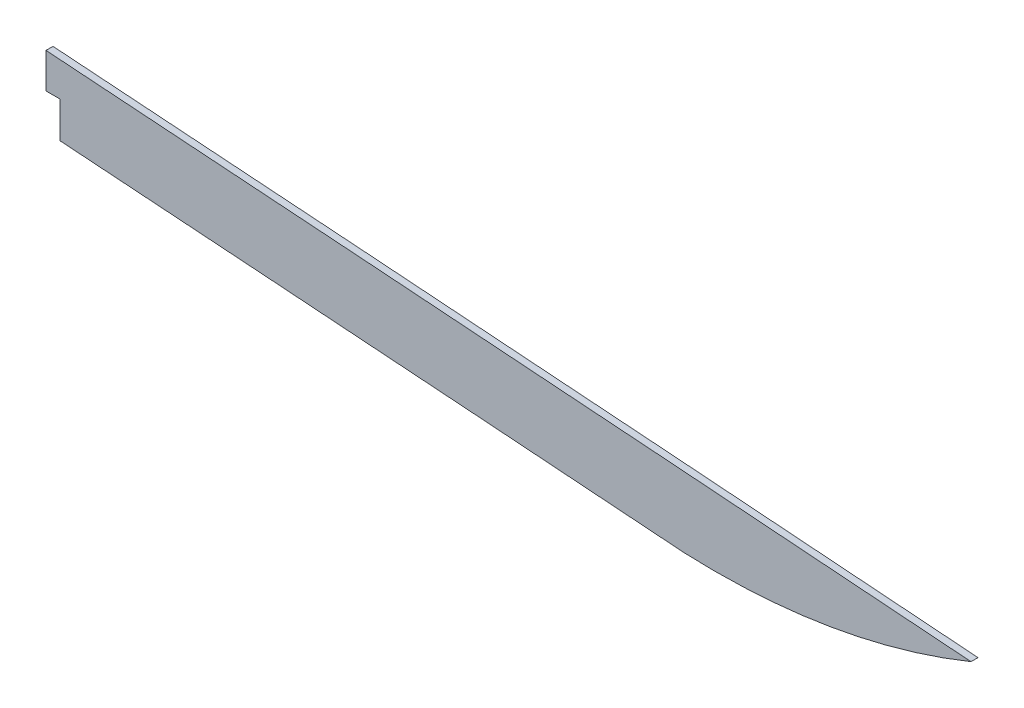
ISO-10303-21;
HEADER;
FILE_DESCRIPTION(('STEP AP214'),'2;1');
FILE_NAME('part.step','',(''),(''),'','','');
FILE_SCHEMA(('AUTOMOTIVE_DESIGN { 1 0 10303 214 1 1 1 1 }'));
ENDSEC;
DATA;
#1=APPLICATION_CONTEXT('core data for automotive mechanical design processes');
#2=APPLICATION_PROTOCOL_DEFINITION('international standard','automotive_design',2000,#1);
#3=PRODUCT_CONTEXT('',#1,'mechanical');
#4=PRODUCT('Part','Part','',(#3));
#5=PRODUCT_RELATED_PRODUCT_CATEGORY('part','',(#4));
#6=PRODUCT_DEFINITION_FORMATION('','',#4);
#7=PRODUCT_DEFINITION_CONTEXT('part definition',#1,'design');
#8=PRODUCT_DEFINITION('design','',#6,#7);
#9=PRODUCT_DEFINITION_SHAPE('','',#8);
#10=(LENGTH_UNIT() NAMED_UNIT(*) SI_UNIT(.MILLI.,.METRE.));
#11=(NAMED_UNIT(*) PLANE_ANGLE_UNIT() SI_UNIT($,.RADIAN.));
#12=(NAMED_UNIT(*) SI_UNIT($,.STERADIAN.) SOLID_ANGLE_UNIT());
#13=UNCERTAINTY_MEASURE_WITH_UNIT(LENGTH_MEASURE(1.E-05),#10,'distance_accuracy_value','');
#14=(GEOMETRIC_REPRESENTATION_CONTEXT(3) GLOBAL_UNCERTAINTY_ASSIGNED_CONTEXT((#13)) GLOBAL_UNIT_ASSIGNED_CONTEXT((#10,
#11,#12)) REPRESENTATION_CONTEXT('',''));
#15=CARTESIAN_POINT('',(0.,0.,0.));
#16=DIRECTION('',(0.,0.,1.));
#17=DIRECTION('',(1.,0.,0.));
#18=AXIS2_PLACEMENT_3D('',#15,#16,#17);
#19=CARTESIAN_POINT('',(911.080534452719,-165.459917438795,10.));
#20=CARTESIAN_POINT('',(1125.12411268424,-174.190190217344,10.));
#21=CARTESIAN_POINT('',(1319.07797417771,-95.3983027945653,10.));
#22=B_SPLINE_CURVE_WITH_KNOTS('',2,(#19,#20,#21),.UNSPECIFIED.,.F.,.F.,(3,3),(0.,1.),.UNSPECIFIED.);
#23=DIRECTION('',(0.,0.,-1.));
#24=VECTOR('',#23,1.);
#25=SURFACE_OF_LINEAR_EXTRUSION('',#22,#24);
#26=CARTESIAN_POINT('',(911.080534452719,-165.459917438795,0.));
#27=CARTESIAN_POINT('',(1125.12411268424,-174.190190217344,0.));
#28=CARTESIAN_POINT('',(1319.07797417771,-95.3983027945653,0.));
#29=B_SPLINE_CURVE_WITH_KNOTS('',2,(#26,#27,#28),.UNSPECIFIED.,.F.,.F.,(3,3),(0.,1.),.UNSPECIFIED.);
#30=CARTESIAN_POINT('',(911.080534452743,-165.459917438341,0.));
#31=VERTEX_POINT('',#30);
#32=CARTESIAN_POINT('',(1319.07797417775,-95.3983027938534,0.));
#33=VERTEX_POINT('',#32);
#34=EDGE_CURVE('E133',#31,#33,#29,.T.);
#35=ORIENTED_EDGE('',*,*,#34,.T.);
#36=DIRECTION('',(0.,0.,-1.));
#37=VECTOR('',#36,1.);
#38=CARTESIAN_POINT('',(1319.07797417775,-95.3983027938534,10.));
#39=LINE('',#38,#37);
#40=CARTESIAN_POINT('',(1319.07797417775,-95.3983027938534,10.));
#41=VERTEX_POINT('',#40);
#42=EDGE_CURVE('E11',#41,#33,#39,.T.);
#43=ORIENTED_EDGE('',*,*,#42,.F.);
#44=CARTESIAN_POINT('',(911.080534452743,-165.459917438341,10.));
#45=VERTEX_POINT('',#44);
#46=EDGE_CURVE('E154',#45,#41,#22,.T.);
#47=ORIENTED_EDGE('',*,*,#46,.F.);
#48=DIRECTION('',(0.,0.,-1.));
#49=VECTOR('',#48,1.);
#50=CARTESIAN_POINT('',(911.080534452743,-165.459917438341,10.));
#51=LINE('',#50,#49);
#52=EDGE_CURVE('E129',#45,#31,#51,.T.);
#53=ORIENTED_EDGE('',*,*,#52,.T.);
#54=EDGE_LOOP('',(#35,#43,#47,#53));
#55=FACE_BOUND('',#54,.T.);
#56=ADVANCED_FACE('F43',(#55),#25,.F.);
#57=CARTESIAN_POINT('',(-18662.16059314,-267209.981847863,10.));
#58=DIRECTION('',(0.,0.,-1.));
#59=DIRECTION('',(-1.,0.,0.));
#60=AXIS2_PLACEMENT_3D('',#57,#58,#59);
#61=CYLINDRICAL_SURFACE('',#60,267860.879258506);
#62=CARTESIAN_POINT('',(-18662.16059314,-267209.981847863,0.));
#63=DIRECTION('',(0.,0.,1.));
#64=DIRECTION('',(1.,0.,0.));
#65=AXIS2_PLACEMENT_3D('',#62,#63,#64);
#66=CIRCLE('',#65,267860.879258506);
#67=CARTESIAN_POINT('',(8.14992517916835E-09,1.13686837721616E-10,0.));
#68=VERTEX_POINT('',#67);
#69=EDGE_CURVE('E139',#33,#68,#66,.T.);
#70=ORIENTED_EDGE('',*,*,#69,.T.);
#71=DIRECTION('',(0.,0.,-1.));
#72=VECTOR('',#71,1.);
#73=CARTESIAN_POINT('',(8.14992517916835E-09,1.13686837721616E-10,10.));
#74=LINE('',#73,#72);
#75=CARTESIAN_POINT('',(8.14992517916835E-09,1.13686837721616E-10,10.));
#76=VERTEX_POINT('',#75);
#77=EDGE_CURVE('E53',#76,#68,#74,.T.);
#78=ORIENTED_EDGE('',*,*,#77,.F.);
#79=CARTESIAN_POINT('',(-18662.16059314,-267209.981847863,10.));
#80=DIRECTION('',(0.,0.,1.));
#81=DIRECTION('',(1.,0.,0.));
#82=AXIS2_PLACEMENT_3D('',#79,#80,#81);
#83=CIRCLE('',#82,267860.879258506);
#84=EDGE_CURVE('E98',#41,#76,#83,.T.);
#85=ORIENTED_EDGE('',*,*,#84,.F.);
#86=ORIENTED_EDGE('',*,*,#42,.T.);
#87=EDGE_LOOP('',(#70,#78,#85,#86));
#88=FACE_BOUND('',#87,.T.);
#89=ADVANCED_FACE('F182',(#88),#61,.T.);
#90=CARTESIAN_POINT('',(8.22808488010196E-09,8.5265128291212E-10,10.));
#91=DIRECTION('',(1.,0.,0.));
#92=DIRECTION('',(0.,0.,-1.));
#93=AXIS2_PLACEMENT_3D('',#90,#91,#92);
#94=PLANE('',#93);
#95=DIRECTION('',(0.,-1.,0.));
#96=VECTOR('',#95,1.);
#97=CARTESIAN_POINT('',(8.22808488010196E-09,8.5265128291212E-10,0.));
#98=LINE('',#97,#96);
#99=CARTESIAN_POINT('',(8.22808488010196E-09,-50.1218407672741,0.));
#100=VERTEX_POINT('',#99);
#101=EDGE_CURVE('E145',#68,#100,#98,.T.);
#102=ORIENTED_EDGE('',*,*,#101,.T.);
#103=DIRECTION('',(0.,0.,-1.));
#104=VECTOR('',#103,1.);
#105=CARTESIAN_POINT('',(8.22808488010196E-09,-50.1218407672741,10.));
#106=LINE('',#105,#104);
#107=CARTESIAN_POINT('',(8.22808488010196E-09,-50.1218407672741,10.));
#108=VERTEX_POINT('',#107);
#109=EDGE_CURVE('E122',#108,#100,#106,.T.);
#110=ORIENTED_EDGE('',*,*,#109,.F.);
#111=DIRECTION('',(0.,-1.,0.));
#112=VECTOR('',#111,1.);
#113=CARTESIAN_POINT('',(8.22808488010196E-09,8.5265128291212E-10,10.));
#114=LINE('',#113,#112);
#115=EDGE_CURVE('E111',#76,#108,#114,.T.);
#116=ORIENTED_EDGE('',*,*,#115,.F.);
#117=ORIENTED_EDGE('',*,*,#77,.T.);
#118=EDGE_LOOP('',(#102,#110,#116,#117));
#119=FACE_BOUND('',#118,.T.);
#120=ADVANCED_FACE('F164',(#119),#94,.F.);
#121=CARTESIAN_POINT('',(8.22808488010196E-09,-50.1218407672741,10.));
#122=DIRECTION('',(-1.42108547154746E-12,1.,0.));
#123=DIRECTION('',(-1.,-1.42108547154746E-12,0.));
#124=AXIS2_PLACEMENT_3D('',#121,#122,#123);
#125=PLANE('',#124);
#126=DIRECTION('',(1.,1.42108547154746E-12,0.));
#127=VECTOR('',#126,1.);
#128=CARTESIAN_POINT('',(8.22808488010196E-09,-50.1218407672741,0.));
#129=LINE('',#128,#127);
#130=CARTESIAN_POINT('',(20.0000000078444,-50.1218407672457,0.));
#131=VERTEX_POINT('',#130);
#132=EDGE_CURVE('E120',#100,#131,#129,.T.);
#133=ORIENTED_EDGE('',*,*,#132,.T.);
#134=DIRECTION('',(0.,0.,-1.));
#135=VECTOR('',#134,1.);
#136=CARTESIAN_POINT('',(20.0000000078444,-50.1218407672457,10.));
#137=LINE('',#136,#135);
#138=CARTESIAN_POINT('',(20.0000000078444,-50.1218407672457,10.));
#139=VERTEX_POINT('',#138);
#140=EDGE_CURVE('E117',#139,#131,#137,.T.);
#141=ORIENTED_EDGE('',*,*,#140,.F.);
#142=DIRECTION('',(1.,1.42108547154746E-12,0.));
#143=VECTOR('',#142,1.);
#144=CARTESIAN_POINT('',(8.22808488010196E-09,-50.1218407672741,10.));
#145=LINE('',#144,#143);
#146=EDGE_CURVE('E105',#108,#139,#145,.T.);
#147=ORIENTED_EDGE('',*,*,#146,.F.);
#148=ORIENTED_EDGE('',*,*,#109,.T.);
#149=EDGE_LOOP('',(#133,#141,#147,#148));
#150=FACE_BOUND('',#149,.T.);
#151=ADVANCED_FACE('F118',(#150),#125,.F.);
#152=CARTESIAN_POINT('',(20.0000000078444,-50.1218407672457,10.));
#153=DIRECTION('',(1.,0.,0.));
#154=DIRECTION('',(0.,1.,0.));
#155=AXIS2_PLACEMENT_3D('',#152,#153,#154);
#156=PLANE('',#155);
#157=DIRECTION('',(0.,-1.,0.));
#158=VECTOR('',#157,1.);
#159=CARTESIAN_POINT('',(20.0000000078444,-50.1218407672457,0.));
#160=LINE('',#159,#158);
#161=CARTESIAN_POINT('',(20.0000000078433,-101.641774289192,0.));
#162=VERTEX_POINT('',#161);
#163=EDGE_CURVE('E84',#131,#162,#160,.T.);
#164=ORIENTED_EDGE('',*,*,#163,.T.);
#165=DIRECTION('',(0.,0.,-1.));
#166=VECTOR('',#165,1.);
#167=CARTESIAN_POINT('',(20.0000000078433,-101.641774289192,10.));
#168=LINE('',#167,#166);
#169=CARTESIAN_POINT('',(20.0000000078433,-101.641774289192,10.));
#170=VERTEX_POINT('',#169);
#171=EDGE_CURVE('E123',#170,#162,#168,.T.);
#172=ORIENTED_EDGE('',*,*,#171,.F.);
#173=DIRECTION('',(0.,-1.,0.));
#174=VECTOR('',#173,1.);
#175=CARTESIAN_POINT('',(20.0000000078444,-50.1218407672457,10.));
#176=LINE('',#175,#174);
#177=EDGE_CURVE('E109',#139,#170,#176,.T.);
#178=ORIENTED_EDGE('',*,*,#177,.F.);
#179=ORIENTED_EDGE('',*,*,#140,.T.);
#180=EDGE_LOOP('',(#164,#172,#178,#179));
#181=FACE_BOUND('',#180,.T.);
#182=ADVANCED_FACE('F125',(#181),#156,.F.);
#183=CARTESIAN_POINT('',(-18662.16059314,-267209.981847863,10.));
#184=DIRECTION('',(0.,0.,-1.));
#185=DIRECTION('',(-1.,0.,0.));
#186=AXIS2_PLACEMENT_3D('',#183,#184,#185);
#187=CYLINDRICAL_SURFACE('',#186,267760.879258506);
#188=CARTESIAN_POINT('',(-18662.16059314,-267209.981847863,0.));
#189=DIRECTION('',(0.,0.,-1.));
#190=DIRECTION('',(1.,0.,0.));
#191=AXIS2_PLACEMENT_3D('',#188,#189,#190);
#192=CIRCLE('',#191,267760.879258506);
#193=EDGE_CURVE('E90',#162,#31,#192,.T.);
#194=ORIENTED_EDGE('',*,*,#193,.T.);
#195=ORIENTED_EDGE('',*,*,#52,.F.);
#196=CARTESIAN_POINT('',(-18662.16059314,-267209.981847863,10.));
#197=DIRECTION('',(0.,0.,-1.));
#198=DIRECTION('',(1.,0.,0.));
#199=AXIS2_PLACEMENT_3D('',#196,#197,#198);
#200=CIRCLE('',#199,267760.879258506);
#201=EDGE_CURVE('E61',#170,#45,#200,.T.);
#202=ORIENTED_EDGE('',*,*,#201,.F.);
#203=ORIENTED_EDGE('',*,*,#171,.T.);
#204=EDGE_LOOP('',(#194,#195,#202,#203));
#205=FACE_BOUND('',#204,.T.);
#206=ADVANCED_FACE('F171',(#205),#187,.F.);
#207=CARTESIAN_POINT('',(1120.10168349973,-152.309650167012,10.));
#208=DIRECTION('',(0.,0.,1.));
#209=DIRECTION('',(1.,0.,0.));
#210=AXIS2_PLACEMENT_3D('',#207,#208,#209);
#211=PLANE('',#210);
#212=ORIENTED_EDGE('',*,*,#46,.T.);
#213=ORIENTED_EDGE('',*,*,#84,.T.);
#214=ORIENTED_EDGE('',*,*,#115,.T.);
#215=ORIENTED_EDGE('',*,*,#146,.T.);
#216=ORIENTED_EDGE('',*,*,#177,.T.);
#217=ORIENTED_EDGE('',*,*,#201,.T.);
#218=EDGE_LOOP('',(#212,#213,#214,#215,#216,#217));
#219=FACE_BOUND('',#218,.T.);
#220=ADVANCED_FACE('F107',(#219),#211,.T.);
#221=CARTESIAN_POINT('',(1120.10168349973,-152.309650167012,0.));
#222=DIRECTION('',(0.,0.,1.));
#223=DIRECTION('',(1.,0.,0.));
#224=AXIS2_PLACEMENT_3D('',#221,#222,#223);
#225=PLANE('',#224);
#226=ORIENTED_EDGE('',*,*,#34,.F.);
#227=ORIENTED_EDGE('',*,*,#193,.F.);
#228=ORIENTED_EDGE('',*,*,#163,.F.);
#229=ORIENTED_EDGE('',*,*,#132,.F.);
#230=ORIENTED_EDGE('',*,*,#101,.F.);
#231=ORIENTED_EDGE('',*,*,#69,.F.);
#232=EDGE_LOOP('',(#226,#227,#228,#229,#230,#231));
#233=FACE_BOUND('',#232,.T.);
#234=ADVANCED_FACE('F167',(#233),#225,.F.);
#235=CLOSED_SHELL('',(#56,#89,#120,#151,#182,#206,#220,#234));
#236=MANIFOLD_SOLID_BREP('B2',#235);
#237=ADVANCED_BREP_SHAPE_REPRESENTATION('',(#18,#236),#14);
#238=SHAPE_DEFINITION_REPRESENTATION(#9,#237);
ENDSEC;
END-ISO-10303-21;
